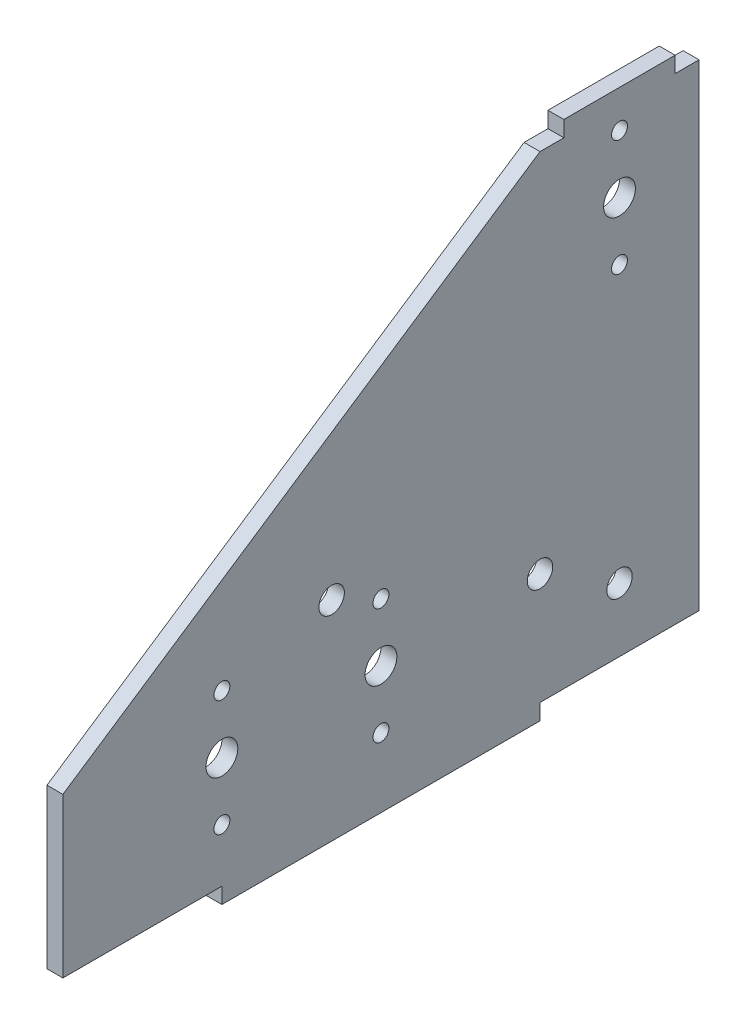
ISO-10303-21;
HEADER;
FILE_DESCRIPTION(('STEP AP214'),'2;1');
FILE_NAME('part.step','',(''),(''),'','','');
FILE_SCHEMA(('AUTOMOTIVE_DESIGN { 1 0 10303 214 1 1 1 1 }'));
ENDSEC;
DATA;
#1=APPLICATION_CONTEXT('core data for automotive mechanical design processes');
#2=APPLICATION_PROTOCOL_DEFINITION('international standard','automotive_design',2000,#1);
#3=PRODUCT_CONTEXT('',#1,'mechanical');
#4=PRODUCT('Part','Part','',(#3));
#5=PRODUCT_RELATED_PRODUCT_CATEGORY('part','',(#4));
#6=PRODUCT_DEFINITION_FORMATION('','',#4);
#7=PRODUCT_DEFINITION_CONTEXT('part definition',#1,'design');
#8=PRODUCT_DEFINITION('design','',#6,#7);
#9=PRODUCT_DEFINITION_SHAPE('','',#8);
#10=(LENGTH_UNIT() NAMED_UNIT(*) SI_UNIT(.MILLI.,.METRE.));
#11=(NAMED_UNIT(*) PLANE_ANGLE_UNIT() SI_UNIT($,.RADIAN.));
#12=(NAMED_UNIT(*) SI_UNIT($,.STERADIAN.) SOLID_ANGLE_UNIT());
#13=UNCERTAINTY_MEASURE_WITH_UNIT(LENGTH_MEASURE(1.E-05),#10,'distance_accuracy_value','');
#14=(GEOMETRIC_REPRESENTATION_CONTEXT(3) GLOBAL_UNCERTAINTY_ASSIGNED_CONTEXT((#13)) GLOBAL_UNIT_ASSIGNED_CONTEXT((#10,
#11,#12)) REPRESENTATION_CONTEXT('',''));
#15=CARTESIAN_POINT('',(0.,0.,0.));
#16=DIRECTION('',(0.,0.,1.));
#17=DIRECTION('',(1.,0.,0.));
#18=AXIS2_PLACEMENT_3D('',#15,#16,#17);
#19=CARTESIAN_POINT('',(5.,0.,0.));
#20=DIRECTION('',(1.,0.,0.));
#21=DIRECTION('',(0.,0.,-1.));
#22=AXIS2_PLACEMENT_3D('',#19,#20,#21);
#23=PLANE('',#22);
#24=CARTESIAN_POINT('',(5.,53.2499999999997,-50.));
#25=DIRECTION('',(1.,0.,0.));
#26=DIRECTION('',(0.,0.,-1.));
#27=AXIS2_PLACEMENT_3D('',#24,#25,#26);
#28=CIRCLE('',#27,2.5);
#29=CARTESIAN_POINT('',(5.,53.2499999999997,-52.5));
#30=VERTEX_POINT('',#29);
#31=EDGE_CURVE('E337',#30,#30,#28,.T.);
#32=ORIENTED_EDGE('',*,*,#31,.F.);
#33=EDGE_LOOP('',(#32));
#34=FACE_BOUND('',#33,.T.);
#35=CARTESIAN_POINT('',(5.,16.75,-100.));
#36=DIRECTION('',(1.,0.,0.));
#37=DIRECTION('',(0.,0.,-1.));
#38=AXIS2_PLACEMENT_3D('',#35,#36,#37);
#39=CIRCLE('',#38,2.50000000000001);
#40=CARTESIAN_POINT('',(5.,16.75,-102.5));
#41=VERTEX_POINT('',#40);
#42=EDGE_CURVE('E349',#41,#41,#39,.T.);
#43=ORIENTED_EDGE('',*,*,#42,.F.);
#44=EDGE_LOOP('',(#43));
#45=FACE_BOUND('',#44,.T.);
#46=CARTESIAN_POINT('',(5.,60.6855990780826,-84.5));
#47=DIRECTION('',(1.,0.,0.));
#48=DIRECTION('',(0.,0.,-1.));
#49=AXIS2_PLACEMENT_3D('',#46,#47,#48);
#50=CIRCLE('',#49,4.00000000000001);
#51=CARTESIAN_POINT('',(5.,60.6855990780826,-88.5));
#52=VERTEX_POINT('',#51);
#53=EDGE_CURVE('E361',#52,#52,#50,.T.);
#54=ORIENTED_EDGE('',*,*,#53,.F.);
#55=EDGE_LOOP('',(#54));
#56=FACE_BOUND('',#55,.T.);
#57=CARTESIAN_POINT('',(5.,106.75,-175.));
#58=DIRECTION('',(1.,0.,0.));
#59=DIRECTION('',(0.,0.,-1.));
#60=AXIS2_PLACEMENT_3D('',#57,#58,#59);
#61=CIRCLE('',#60,2.50000000000002);
#62=CARTESIAN_POINT('',(5.,106.75,-177.5));
#63=VERTEX_POINT('',#62);
#64=EDGE_CURVE('E373',#63,#63,#61,.T.);
#65=ORIENTED_EDGE('',*,*,#64,.F.);
#66=EDGE_LOOP('',(#65));
#67=FACE_BOUND('',#66,.T.);
#68=CARTESIAN_POINT('',(5.,35.,-150.));
#69=DIRECTION('',(1.,0.,0.));
#70=DIRECTION('',(0.,0.,-1.));
#71=AXIS2_PLACEMENT_3D('',#68,#69,#70);
#72=CIRCLE('',#71,3.99999999999999);
#73=CARTESIAN_POINT('',(5.,35.,-154.));
#74=VERTEX_POINT('',#73);
#75=EDGE_CURVE('E385',#74,#74,#72,.T.);
#76=ORIENTED_EDGE('',*,*,#75,.F.);
#77=EDGE_LOOP('',(#76));
#78=FACE_BOUND('',#77,.T.);
#79=CARTESIAN_POINT('',(5.,125.,-175.));
#80=DIRECTION('',(1.,0.,0.));
#81=DIRECTION('',(0.,0.,-1.));
#82=AXIS2_PLACEMENT_3D('',#79,#80,#81);
#83=CIRCLE('',#82,4.99999999999999);
#84=CARTESIAN_POINT('',(5.,125.,-180.));
#85=VERTEX_POINT('',#84);
#86=EDGE_CURVE('E164',#85,#85,#83,.T.);
#87=ORIENTED_EDGE('',*,*,#86,.F.);
#88=EDGE_LOOP('',(#87));
#89=FACE_BOUND('',#88,.T.);
#90=DIRECTION('',(0.,0.,1.));
#91=VECTOR('',#90,1.);
#92=CARTESIAN_POINT('',(5.,150.,-192.5));
#93=LINE('',#92,#91);
#94=CARTESIAN_POINT('',(5.,150.,-200.));
#95=VERTEX_POINT('',#94);
#96=CARTESIAN_POINT('',(5.,150.,-192.5));
#97=VERTEX_POINT('',#96);
#98=EDGE_CURVE('E185',#95,#97,#93,.T.);
#99=ORIENTED_EDGE('',*,*,#98,.T.);
#100=DIRECTION('',(0.,1.,0.));
#101=VECTOR('',#100,1.);
#102=CARTESIAN_POINT('',(5.,150.,-192.5));
#103=LINE('',#102,#101);
#104=CARTESIAN_POINT('',(5.,155.,-192.5));
#105=VERTEX_POINT('',#104);
#106=EDGE_CURVE('E108',#97,#105,#103,.T.);
#107=ORIENTED_EDGE('',*,*,#106,.T.);
#108=DIRECTION('',(0.,0.,1.));
#109=VECTOR('',#108,1.);
#110=CARTESIAN_POINT('',(5.,155.,-157.5));
#111=LINE('',#110,#109);
#112=CARTESIAN_POINT('',(5.,155.,-157.5));
#113=VERTEX_POINT('',#112);
#114=EDGE_CURVE('E215',#105,#113,#111,.T.);
#115=ORIENTED_EDGE('',*,*,#114,.T.);
#116=DIRECTION('',(0.,-1.,0.));
#117=VECTOR('',#116,1.);
#118=CARTESIAN_POINT('',(5.,150.,-157.5));
#119=LINE('',#118,#117);
#120=CARTESIAN_POINT('',(5.,150.,-157.5));
#121=VERTEX_POINT('',#120);
#122=EDGE_CURVE('E234',#113,#121,#119,.T.);
#123=ORIENTED_EDGE('',*,*,#122,.T.);
#124=DIRECTION('',(0.,0.,1.));
#125=VECTOR('',#124,1.);
#126=CARTESIAN_POINT('',(5.,150.,-150.));
#127=LINE('',#126,#125);
#128=CARTESIAN_POINT('',(5.,150.,-150.));
#129=VERTEX_POINT('',#128);
#130=EDGE_CURVE('E231',#121,#129,#127,.T.);
#131=ORIENTED_EDGE('',*,*,#130,.T.);
#132=DIRECTION('',(0.,-0.554700196225229,0.832050294337844));
#133=VECTOR('',#132,1.);
#134=CARTESIAN_POINT('',(5.,150.,-150.));
#135=LINE('',#134,#133);
#136=CARTESIAN_POINT('',(5.,50.,0.));
#137=VERTEX_POINT('',#136);
#138=EDGE_CURVE('E233',#129,#137,#135,.T.);
#139=ORIENTED_EDGE('',*,*,#138,.T.);
#140=DIRECTION('',(0.,-1.,0.));
#141=VECTOR('',#140,1.);
#142=CARTESIAN_POINT('',(5.,0.,0.));
#143=LINE('',#142,#141);
#144=CARTESIAN_POINT('',(5.,0.,0.));
#145=VERTEX_POINT('',#144);
#146=EDGE_CURVE('E236',#137,#145,#143,.T.);
#147=ORIENTED_EDGE('',*,*,#146,.T.);
#148=DIRECTION('',(0.,0.,-1.));
#149=VECTOR('',#148,1.);
#150=CARTESIAN_POINT('',(5.,0.,0.));
#151=LINE('',#150,#149);
#152=CARTESIAN_POINT('',(5.,0.,-50.));
#153=VERTEX_POINT('',#152);
#154=EDGE_CURVE('E242',#145,#153,#151,.T.);
#155=ORIENTED_EDGE('',*,*,#154,.T.);
#156=DIRECTION('',(0.,-1.,0.));
#157=VECTOR('',#156,1.);
#158=CARTESIAN_POINT('',(5.,0.,-50.));
#159=LINE('',#158,#157);
#160=CARTESIAN_POINT('',(5.,-5.,-50.));
#161=VERTEX_POINT('',#160);
#162=EDGE_CURVE('E244',#153,#161,#159,.T.);
#163=ORIENTED_EDGE('',*,*,#162,.T.);
#164=DIRECTION('',(0.,0.,-1.));
#165=VECTOR('',#164,1.);
#166=CARTESIAN_POINT('',(5.,-5.,-50.));
#167=LINE('',#166,#165);
#168=CARTESIAN_POINT('',(5.,-5.,-150.));
#169=VERTEX_POINT('',#168);
#170=EDGE_CURVE('E142',#161,#169,#167,.T.);
#171=ORIENTED_EDGE('',*,*,#170,.T.);
#172=DIRECTION('',(0.,1.,0.));
#173=VECTOR('',#172,1.);
#174=CARTESIAN_POINT('',(5.,0.,-150.));
#175=LINE('',#174,#173);
#176=CARTESIAN_POINT('',(5.,0.,-150.));
#177=VERTEX_POINT('',#176);
#178=EDGE_CURVE('E136',#169,#177,#175,.T.);
#179=ORIENTED_EDGE('',*,*,#178,.T.);
#180=DIRECTION('',(0.,0.,-1.));
#181=VECTOR('',#180,1.);
#182=CARTESIAN_POINT('',(5.,0.,-150.));
#183=LINE('',#182,#181);
#184=CARTESIAN_POINT('',(5.,0.,-200.));
#185=VERTEX_POINT('',#184);
#186=EDGE_CURVE('E140',#177,#185,#183,.T.);
#187=ORIENTED_EDGE('',*,*,#186,.T.);
#188=DIRECTION('',(0.,1.,0.));
#189=VECTOR('',#188,1.);
#190=CARTESIAN_POINT('',(5.,0.,-200.));
#191=LINE('',#190,#189);
#192=EDGE_CURVE('E50',#185,#95,#191,.T.);
#193=ORIENTED_EDGE('',*,*,#192,.T.);
#194=EDGE_LOOP('',(#99,#107,#115,#123,#131,#139,#147,#155,#163,#171,#179,#187,#193));
#195=FACE_BOUND('',#194,.T.);
#196=CARTESIAN_POINT('',(5.,20.,-175.));
#197=DIRECTION('',(1.,0.,0.));
#198=DIRECTION('',(0.,0.,-1.));
#199=AXIS2_PLACEMENT_3D('',#196,#197,#198);
#200=CIRCLE('',#199,3.99999999999999);
#201=CARTESIAN_POINT('',(5.,20.,-179.));
#202=VERTEX_POINT('',#201);
#203=EDGE_CURVE('E391',#202,#202,#200,.T.);
#204=ORIENTED_EDGE('',*,*,#203,.F.);
#205=EDGE_LOOP('',(#204));
#206=FACE_BOUND('',#205,.T.);
#207=CARTESIAN_POINT('',(5.,143.25,-175.));
#208=DIRECTION('',(1.,0.,0.));
#209=DIRECTION('',(0.,0.,-1.));
#210=AXIS2_PLACEMENT_3D('',#207,#208,#209);
#211=CIRCLE('',#210,2.50000000000002);
#212=CARTESIAN_POINT('',(5.,143.25,-177.5));
#213=VERTEX_POINT('',#212);
#214=EDGE_CURVE('E379',#213,#213,#211,.T.);
#215=ORIENTED_EDGE('',*,*,#214,.F.);
#216=EDGE_LOOP('',(#215));
#217=FACE_BOUND('',#216,.T.);
#218=CARTESIAN_POINT('',(5.,35.,-100.));
#219=DIRECTION('',(1.,0.,0.));
#220=DIRECTION('',(0.,0.,-1.));
#221=AXIS2_PLACEMENT_3D('',#218,#219,#220);
#222=CIRCLE('',#221,5.00000000000001);
#223=CARTESIAN_POINT('',(5.,35.,-105.));
#224=VERTEX_POINT('',#223);
#225=EDGE_CURVE('E367',#224,#224,#222,.T.);
#226=ORIENTED_EDGE('',*,*,#225,.F.);
#227=EDGE_LOOP('',(#226));
#228=FACE_BOUND('',#227,.T.);
#229=CARTESIAN_POINT('',(5.,53.25,-100.));
#230=DIRECTION('',(1.,0.,0.));
#231=DIRECTION('',(0.,0.,-1.));
#232=AXIS2_PLACEMENT_3D('',#229,#230,#231);
#233=CIRCLE('',#232,2.49999999999999);
#234=CARTESIAN_POINT('',(5.,53.25,-102.5));
#235=VERTEX_POINT('',#234);
#236=EDGE_CURVE('E355',#235,#235,#233,.T.);
#237=ORIENTED_EDGE('',*,*,#236,.F.);
#238=EDGE_LOOP('',(#237));
#239=FACE_BOUND('',#238,.T.);
#240=CARTESIAN_POINT('',(5.,34.9999999999997,-50.));
#241=DIRECTION('',(1.,0.,0.));
#242=DIRECTION('',(0.,0.,-1.));
#243=AXIS2_PLACEMENT_3D('',#240,#241,#242);
#244=CIRCLE('',#243,5.);
#245=CARTESIAN_POINT('',(5.,34.9999999999997,-55.));
#246=VERTEX_POINT('',#245);
#247=EDGE_CURVE('E343',#246,#246,#244,.T.);
#248=ORIENTED_EDGE('',*,*,#247,.F.);
#249=EDGE_LOOP('',(#248));
#250=FACE_BOUND('',#249,.T.);
#251=CARTESIAN_POINT('',(5.,16.7499999999997,-50.0000000000004));
#252=DIRECTION('',(1.,0.,0.));
#253=DIRECTION('',(0.,0.,-1.));
#254=AXIS2_PLACEMENT_3D('',#251,#252,#253);
#255=CIRCLE('',#254,2.50000000000001);
#256=CARTESIAN_POINT('',(5.,16.7499999999997,-52.5000000000004));
#257=VERTEX_POINT('',#256);
#258=EDGE_CURVE('E328',#257,#257,#255,.T.);
#259=ORIENTED_EDGE('',*,*,#258,.F.);
#260=EDGE_LOOP('',(#259));
#261=FACE_BOUND('',#260,.T.);
#262=ADVANCED_FACE('F33',(#34,#45,#56,#67,#78,#89,#195,#206,#217,#228,#239,#250,#261),#23,.T.);
#263=CARTESIAN_POINT('',(0.,0.,0.));
#264=DIRECTION('',(1.,0.,0.));
#265=DIRECTION('',(0.,0.,-1.));
#266=AXIS2_PLACEMENT_3D('',#263,#264,#265);
#267=PLANE('',#266);
#268=CARTESIAN_POINT('',(0.,53.2499999999997,-50.));
#269=DIRECTION('',(1.,0.,0.));
#270=DIRECTION('',(0.,0.,-1.));
#271=AXIS2_PLACEMENT_3D('',#268,#269,#270);
#272=CIRCLE('',#271,2.5);
#273=CARTESIAN_POINT('',(0.,53.2499999999997,-52.5));
#274=VERTEX_POINT('',#273);
#275=EDGE_CURVE('E334',#274,#274,#272,.T.);
#276=ORIENTED_EDGE('',*,*,#275,.T.);
#277=EDGE_LOOP('',(#276));
#278=FACE_BOUND('',#277,.T.);
#279=CARTESIAN_POINT('',(0.,16.75,-100.));
#280=DIRECTION('',(1.,0.,0.));
#281=DIRECTION('',(0.,0.,-1.));
#282=AXIS2_PLACEMENT_3D('',#279,#280,#281);
#283=CIRCLE('',#282,2.50000000000001);
#284=CARTESIAN_POINT('',(0.,16.75,-102.5));
#285=VERTEX_POINT('',#284);
#286=EDGE_CURVE('E346',#285,#285,#283,.T.);
#287=ORIENTED_EDGE('',*,*,#286,.T.);
#288=EDGE_LOOP('',(#287));
#289=FACE_BOUND('',#288,.T.);
#290=CARTESIAN_POINT('',(0.,60.6855990780826,-84.5));
#291=DIRECTION('',(1.,0.,0.));
#292=DIRECTION('',(0.,0.,-1.));
#293=AXIS2_PLACEMENT_3D('',#290,#291,#292);
#294=CIRCLE('',#293,4.00000000000001);
#295=CARTESIAN_POINT('',(0.,60.6855990780826,-88.5));
#296=VERTEX_POINT('',#295);
#297=EDGE_CURVE('E358',#296,#296,#294,.T.);
#298=ORIENTED_EDGE('',*,*,#297,.T.);
#299=EDGE_LOOP('',(#298));
#300=FACE_BOUND('',#299,.T.);
#301=CARTESIAN_POINT('',(0.,106.75,-175.));
#302=DIRECTION('',(1.,0.,0.));
#303=DIRECTION('',(0.,0.,-1.));
#304=AXIS2_PLACEMENT_3D('',#301,#302,#303);
#305=CIRCLE('',#304,2.50000000000002);
#306=CARTESIAN_POINT('',(0.,106.75,-177.5));
#307=VERTEX_POINT('',#306);
#308=EDGE_CURVE('E370',#307,#307,#305,.T.);
#309=ORIENTED_EDGE('',*,*,#308,.T.);
#310=EDGE_LOOP('',(#309));
#311=FACE_BOUND('',#310,.T.);
#312=CARTESIAN_POINT('',(0.,35.,-150.));
#313=DIRECTION('',(1.,0.,0.));
#314=DIRECTION('',(0.,0.,-1.));
#315=AXIS2_PLACEMENT_3D('',#312,#313,#314);
#316=CIRCLE('',#315,3.99999999999999);
#317=CARTESIAN_POINT('',(0.,35.,-154.));
#318=VERTEX_POINT('',#317);
#319=EDGE_CURVE('E382',#318,#318,#316,.T.);
#320=ORIENTED_EDGE('',*,*,#319,.T.);
#321=EDGE_LOOP('',(#320));
#322=FACE_BOUND('',#321,.T.);
#323=CARTESIAN_POINT('',(0.,125.,-175.));
#324=DIRECTION('',(1.,0.,0.));
#325=DIRECTION('',(0.,0.,-1.));
#326=AXIS2_PLACEMENT_3D('',#323,#324,#325);
#327=CIRCLE('',#326,4.99999999999999);
#328=CARTESIAN_POINT('',(0.,125.,-180.));
#329=VERTEX_POINT('',#328);
#330=EDGE_CURVE('E394',#329,#329,#327,.T.);
#331=ORIENTED_EDGE('',*,*,#330,.T.);
#332=EDGE_LOOP('',(#331));
#333=FACE_BOUND('',#332,.T.);
#334=DIRECTION('',(0.,0.,1.));
#335=VECTOR('',#334,1.);
#336=CARTESIAN_POINT('',(0.,150.,-192.5));
#337=LINE('',#336,#335);
#338=CARTESIAN_POINT('',(0.,150.,-200.));
#339=VERTEX_POINT('',#338);
#340=CARTESIAN_POINT('',(0.,150.,-192.5));
#341=VERTEX_POINT('',#340);
#342=EDGE_CURVE('E160',#339,#341,#337,.T.);
#343=ORIENTED_EDGE('',*,*,#342,.F.);
#344=DIRECTION('',(0.,1.,0.));
#345=VECTOR('',#344,1.);
#346=CARTESIAN_POINT('',(0.,0.,-200.));
#347=LINE('',#346,#345);
#348=CARTESIAN_POINT('',(0.,0.,-200.));
#349=VERTEX_POINT('',#348);
#350=EDGE_CURVE('E100',#349,#339,#347,.T.);
#351=ORIENTED_EDGE('',*,*,#350,.F.);
#352=DIRECTION('',(0.,0.,-1.));
#353=VECTOR('',#352,1.);
#354=CARTESIAN_POINT('',(0.,0.,-150.));
#355=LINE('',#354,#353);
#356=CARTESIAN_POINT('',(0.,0.,-150.));
#357=VERTEX_POINT('',#356);
#358=EDGE_CURVE('E94',#357,#349,#355,.T.);
#359=ORIENTED_EDGE('',*,*,#358,.F.);
#360=DIRECTION('',(0.,1.,0.));
#361=VECTOR('',#360,1.);
#362=CARTESIAN_POINT('',(0.,0.,-150.));
#363=LINE('',#362,#361);
#364=CARTESIAN_POINT('',(0.,-5.,-150.));
#365=VERTEX_POINT('',#364);
#366=EDGE_CURVE('E150',#365,#357,#363,.T.);
#367=ORIENTED_EDGE('',*,*,#366,.F.);
#368=DIRECTION('',(0.,0.,-1.));
#369=VECTOR('',#368,1.);
#370=CARTESIAN_POINT('',(0.,-5.,-50.));
#371=LINE('',#370,#369);
#372=CARTESIAN_POINT('',(0.,-5.,-50.));
#373=VERTEX_POINT('',#372);
#374=EDGE_CURVE('E180',#373,#365,#371,.T.);
#375=ORIENTED_EDGE('',*,*,#374,.F.);
#376=DIRECTION('',(0.,-1.,0.));
#377=VECTOR('',#376,1.);
#378=CARTESIAN_POINT('',(0.,0.,-50.));
#379=LINE('',#378,#377);
#380=CARTESIAN_POINT('',(0.,0.,-50.));
#381=VERTEX_POINT('',#380);
#382=EDGE_CURVE('E178',#381,#373,#379,.T.);
#383=ORIENTED_EDGE('',*,*,#382,.F.);
#384=DIRECTION('',(0.,0.,-1.));
#385=VECTOR('',#384,1.);
#386=CARTESIAN_POINT('',(0.,0.,0.));
#387=LINE('',#386,#385);
#388=CARTESIAN_POINT('',(0.,0.,0.));
#389=VERTEX_POINT('',#388);
#390=EDGE_CURVE('E176',#389,#381,#387,.T.);
#391=ORIENTED_EDGE('',*,*,#390,.F.);
#392=DIRECTION('',(0.,-1.,0.));
#393=VECTOR('',#392,1.);
#394=CARTESIAN_POINT('',(0.,0.,0.));
#395=LINE('',#394,#393);
#396=CARTESIAN_POINT('',(0.,50.,0.));
#397=VERTEX_POINT('',#396);
#398=EDGE_CURVE('E174',#397,#389,#395,.T.);
#399=ORIENTED_EDGE('',*,*,#398,.F.);
#400=DIRECTION('',(0.,-0.554700196225229,0.832050294337844));
#401=VECTOR('',#400,1.);
#402=CARTESIAN_POINT('',(0.,150.,-150.));
#403=LINE('',#402,#401);
#404=CARTESIAN_POINT('',(0.,150.,-150.));
#405=VERTEX_POINT('',#404);
#406=EDGE_CURVE('E172',#405,#397,#403,.T.);
#407=ORIENTED_EDGE('',*,*,#406,.F.);
#408=DIRECTION('',(0.,0.,1.));
#409=VECTOR('',#408,1.);
#410=CARTESIAN_POINT('',(0.,150.,-150.));
#411=LINE('',#410,#409);
#412=CARTESIAN_POINT('',(0.,150.,-157.5));
#413=VERTEX_POINT('',#412);
#414=EDGE_CURVE('E170',#413,#405,#411,.T.);
#415=ORIENTED_EDGE('',*,*,#414,.F.);
#416=DIRECTION('',(0.,-1.,0.));
#417=VECTOR('',#416,1.);
#418=CARTESIAN_POINT('',(0.,150.,-157.5));
#419=LINE('',#418,#417);
#420=CARTESIAN_POINT('',(0.,155.,-157.5));
#421=VERTEX_POINT('',#420);
#422=EDGE_CURVE('E168',#421,#413,#419,.T.);
#423=ORIENTED_EDGE('',*,*,#422,.F.);
#424=DIRECTION('',(0.,0.,1.));
#425=VECTOR('',#424,1.);
#426=CARTESIAN_POINT('',(0.,155.,-157.5));
#427=LINE('',#426,#425);
#428=CARTESIAN_POINT('',(0.,155.,-192.5));
#429=VERTEX_POINT('',#428);
#430=EDGE_CURVE('E166',#429,#421,#427,.T.);
#431=ORIENTED_EDGE('',*,*,#430,.F.);
#432=DIRECTION('',(0.,1.,0.));
#433=VECTOR('',#432,1.);
#434=CARTESIAN_POINT('',(0.,150.,-192.5));
#435=LINE('',#434,#433);
#436=EDGE_CURVE('E163',#341,#429,#435,.T.);
#437=ORIENTED_EDGE('',*,*,#436,.F.);
#438=EDGE_LOOP('',(#343,#351,#359,#367,#375,#383,#391,#399,#407,#415,#423,#431,#437));
#439=FACE_BOUND('',#438,.T.);
#440=CARTESIAN_POINT('',(0.,20.,-175.));
#441=DIRECTION('',(1.,0.,0.));
#442=DIRECTION('',(0.,0.,-1.));
#443=AXIS2_PLACEMENT_3D('',#440,#441,#442);
#444=CIRCLE('',#443,3.99999999999999);
#445=CARTESIAN_POINT('',(0.,20.,-179.));
#446=VERTEX_POINT('',#445);
#447=EDGE_CURVE('E388',#446,#446,#444,.T.);
#448=ORIENTED_EDGE('',*,*,#447,.T.);
#449=EDGE_LOOP('',(#448));
#450=FACE_BOUND('',#449,.T.);
#451=CARTESIAN_POINT('',(0.,143.25,-175.));
#452=DIRECTION('',(1.,0.,0.));
#453=DIRECTION('',(0.,0.,-1.));
#454=AXIS2_PLACEMENT_3D('',#451,#452,#453);
#455=CIRCLE('',#454,2.50000000000002);
#456=CARTESIAN_POINT('',(0.,143.25,-177.5));
#457=VERTEX_POINT('',#456);
#458=EDGE_CURVE('E376',#457,#457,#455,.T.);
#459=ORIENTED_EDGE('',*,*,#458,.T.);
#460=EDGE_LOOP('',(#459));
#461=FACE_BOUND('',#460,.T.);
#462=CARTESIAN_POINT('',(0.,35.,-100.));
#463=DIRECTION('',(1.,0.,0.));
#464=DIRECTION('',(0.,0.,-1.));
#465=AXIS2_PLACEMENT_3D('',#462,#463,#464);
#466=CIRCLE('',#465,5.00000000000001);
#467=CARTESIAN_POINT('',(0.,35.,-105.));
#468=VERTEX_POINT('',#467);
#469=EDGE_CURVE('E364',#468,#468,#466,.T.);
#470=ORIENTED_EDGE('',*,*,#469,.T.);
#471=EDGE_LOOP('',(#470));
#472=FACE_BOUND('',#471,.T.);
#473=CARTESIAN_POINT('',(0.,53.25,-100.));
#474=DIRECTION('',(1.,0.,0.));
#475=DIRECTION('',(0.,0.,-1.));
#476=AXIS2_PLACEMENT_3D('',#473,#474,#475);
#477=CIRCLE('',#476,2.49999999999999);
#478=CARTESIAN_POINT('',(0.,53.25,-102.5));
#479=VERTEX_POINT('',#478);
#480=EDGE_CURVE('E352',#479,#479,#477,.T.);
#481=ORIENTED_EDGE('',*,*,#480,.T.);
#482=EDGE_LOOP('',(#481));
#483=FACE_BOUND('',#482,.T.);
#484=CARTESIAN_POINT('',(0.,34.9999999999997,-50.));
#485=DIRECTION('',(1.,0.,0.));
#486=DIRECTION('',(0.,0.,-1.));
#487=AXIS2_PLACEMENT_3D('',#484,#485,#486);
#488=CIRCLE('',#487,5.);
#489=CARTESIAN_POINT('',(0.,34.9999999999997,-55.));
#490=VERTEX_POINT('',#489);
#491=EDGE_CURVE('E340',#490,#490,#488,.T.);
#492=ORIENTED_EDGE('',*,*,#491,.T.);
#493=EDGE_LOOP('',(#492));
#494=FACE_BOUND('',#493,.T.);
#495=CARTESIAN_POINT('',(0.,16.7499999999997,-50.0000000000004));
#496=DIRECTION('',(1.,0.,0.));
#497=DIRECTION('',(0.,0.,-1.));
#498=AXIS2_PLACEMENT_3D('',#495,#496,#497);
#499=CIRCLE('',#498,2.50000000000001);
#500=CARTESIAN_POINT('',(0.,16.7499999999997,-52.5000000000004));
#501=VERTEX_POINT('',#500);
#502=EDGE_CURVE('E331',#501,#501,#499,.T.);
#503=ORIENTED_EDGE('',*,*,#502,.T.);
#504=EDGE_LOOP('',(#503));
#505=FACE_BOUND('',#504,.T.);
#506=ADVANCED_FACE('F219',(#278,#289,#300,#311,#322,#333,#439,#450,#461,#472,#483,#494,#505),
#267,.F.);
#507=CARTESIAN_POINT('',(5.,150.,-192.5));
#508=DIRECTION('',(0.,-1.,0.));
#509=DIRECTION('',(0.,0.,-1.));
#510=AXIS2_PLACEMENT_3D('',#507,#508,#509);
#511=PLANE('',#510);
#512=ORIENTED_EDGE('',*,*,#342,.T.);
#513=DIRECTION('',(-1.,0.,0.));
#514=VECTOR('',#513,1.);
#515=CARTESIAN_POINT('',(5.,150.,-192.5));
#516=LINE('',#515,#514);
#517=EDGE_CURVE('E11',#97,#341,#516,.T.);
#518=ORIENTED_EDGE('',*,*,#517,.F.);
#519=ORIENTED_EDGE('',*,*,#98,.F.);
#520=DIRECTION('',(-1.,0.,0.));
#521=VECTOR('',#520,1.);
#522=CARTESIAN_POINT('',(5.,150.,-200.));
#523=LINE('',#522,#521);
#524=EDGE_CURVE('E156',#95,#339,#523,.T.);
#525=ORIENTED_EDGE('',*,*,#524,.T.);
#526=EDGE_LOOP('',(#512,#518,#519,#525));
#527=FACE_BOUND('',#526,.T.);
#528=ADVANCED_FACE('F35',(#527),#511,.F.);
#529=CARTESIAN_POINT('',(5.,150.,-192.5));
#530=DIRECTION('',(0.,0.,1.));
#531=DIRECTION('',(1.,0.,0.));
#532=AXIS2_PLACEMENT_3D('',#529,#530,#531);
#533=PLANE('',#532);
#534=ORIENTED_EDGE('',*,*,#436,.T.);
#535=DIRECTION('',(-1.,0.,0.));
#536=VECTOR('',#535,1.);
#537=CARTESIAN_POINT('',(5.,155.,-192.5));
#538=LINE('',#537,#536);
#539=EDGE_CURVE('E42',#105,#429,#538,.T.);
#540=ORIENTED_EDGE('',*,*,#539,.F.);
#541=ORIENTED_EDGE('',*,*,#106,.F.);
#542=ORIENTED_EDGE('',*,*,#517,.T.);
#543=EDGE_LOOP('',(#534,#540,#541,#542));
#544=FACE_BOUND('',#543,.T.);
#545=ADVANCED_FACE('F585',(#544),#533,.F.);
#546=CARTESIAN_POINT('',(5.,155.,-157.5));
#547=DIRECTION('',(0.,-1.,0.));
#548=DIRECTION('',(0.,0.,-1.));
#549=AXIS2_PLACEMENT_3D('',#546,#547,#548);
#550=PLANE('',#549);
#551=ORIENTED_EDGE('',*,*,#430,.T.);
#552=DIRECTION('',(-1.,0.,0.));
#553=VECTOR('',#552,1.);
#554=CARTESIAN_POINT('',(5.,155.,-157.5));
#555=LINE('',#554,#553);
#556=EDGE_CURVE('E207',#113,#421,#555,.T.);
#557=ORIENTED_EDGE('',*,*,#556,.F.);
#558=ORIENTED_EDGE('',*,*,#114,.F.);
#559=ORIENTED_EDGE('',*,*,#539,.T.);
#560=EDGE_LOOP('',(#551,#557,#558,#559));
#561=FACE_BOUND('',#560,.T.);
#562=ADVANCED_FACE('F213',(#561),#550,.F.);
#563=CARTESIAN_POINT('',(5.,150.,-157.5));
#564=DIRECTION('',(0.,0.,-1.));
#565=DIRECTION('',(-1.,0.,0.));
#566=AXIS2_PLACEMENT_3D('',#563,#564,#565);
#567=PLANE('',#566);
#568=ORIENTED_EDGE('',*,*,#422,.T.);
#569=DIRECTION('',(-1.,0.,0.));
#570=VECTOR('',#569,1.);
#571=CARTESIAN_POINT('',(5.,150.,-157.5));
#572=LINE('',#571,#570);
#573=EDGE_CURVE('E204',#121,#413,#572,.T.);
#574=ORIENTED_EDGE('',*,*,#573,.F.);
#575=ORIENTED_EDGE('',*,*,#122,.F.);
#576=ORIENTED_EDGE('',*,*,#556,.T.);
#577=EDGE_LOOP('',(#568,#574,#575,#576));
#578=FACE_BOUND('',#577,.T.);
#579=ADVANCED_FACE('F225',(#578),#567,.F.);
#580=CARTESIAN_POINT('',(5.,150.,-150.));
#581=DIRECTION('',(0.,-1.,0.));
#582=DIRECTION('',(0.,0.,-1.));
#583=AXIS2_PLACEMENT_3D('',#580,#581,#582);
#584=PLANE('',#583);
#585=ORIENTED_EDGE('',*,*,#414,.T.);
#586=DIRECTION('',(-1.,0.,0.));
#587=VECTOR('',#586,1.);
#588=CARTESIAN_POINT('',(5.,150.,-150.));
#589=LINE('',#588,#587);
#590=EDGE_CURVE('E201',#129,#405,#589,.T.);
#591=ORIENTED_EDGE('',*,*,#590,.F.);
#592=ORIENTED_EDGE('',*,*,#130,.F.);
#593=ORIENTED_EDGE('',*,*,#573,.T.);
#594=EDGE_LOOP('',(#585,#591,#592,#593));
#595=FACE_BOUND('',#594,.T.);
#596=ADVANCED_FACE('F229',(#595),#584,.F.);
#597=CARTESIAN_POINT('',(5.,150.,-150.));
#598=DIRECTION('',(0.,-0.832050294337844,-0.554700196225229));
#599=DIRECTION('',(0.,0.554700196225229,-0.832050294337844));
#600=AXIS2_PLACEMENT_3D('',#597,#598,#599);
#601=PLANE('',#600);
#602=ORIENTED_EDGE('',*,*,#406,.T.);
#603=DIRECTION('',(-1.,0.,0.));
#604=VECTOR('',#603,1.);
#605=CARTESIAN_POINT('',(5.,50.,0.));
#606=LINE('',#605,#604);
#607=EDGE_CURVE('E198',#137,#397,#606,.T.);
#608=ORIENTED_EDGE('',*,*,#607,.F.);
#609=ORIENTED_EDGE('',*,*,#138,.F.);
#610=ORIENTED_EDGE('',*,*,#590,.T.);
#611=EDGE_LOOP('',(#602,#608,#609,#610));
#612=FACE_BOUND('',#611,.T.);
#613=ADVANCED_FACE('F550',(#612),#601,.F.);
#614=CARTESIAN_POINT('',(5.,0.,0.));
#615=DIRECTION('',(0.,0.,-1.));
#616=DIRECTION('',(-1.,0.,0.));
#617=AXIS2_PLACEMENT_3D('',#614,#615,#616);
#618=PLANE('',#617);
#619=ORIENTED_EDGE('',*,*,#398,.T.);
#620=DIRECTION('',(-1.,0.,0.));
#621=VECTOR('',#620,1.);
#622=CARTESIAN_POINT('',(5.,0.,0.));
#623=LINE('',#622,#621);
#624=EDGE_CURVE('E195',#145,#389,#623,.T.);
#625=ORIENTED_EDGE('',*,*,#624,.F.);
#626=ORIENTED_EDGE('',*,*,#146,.F.);
#627=ORIENTED_EDGE('',*,*,#607,.T.);
#628=EDGE_LOOP('',(#619,#625,#626,#627));
#629=FACE_BOUND('',#628,.T.);
#630=ADVANCED_FACE('F540',(#629),#618,.F.);
#631=CARTESIAN_POINT('',(5.,0.,0.));
#632=DIRECTION('',(0.,1.,0.));
#633=DIRECTION('',(0.,0.,1.));
#634=AXIS2_PLACEMENT_3D('',#631,#632,#633);
#635=PLANE('',#634);
#636=ORIENTED_EDGE('',*,*,#390,.T.);
#637=DIRECTION('',(-1.,0.,0.));
#638=VECTOR('',#637,1.);
#639=CARTESIAN_POINT('',(5.,0.,-50.));
#640=LINE('',#639,#638);
#641=EDGE_CURVE('E192',#153,#381,#640,.T.);
#642=ORIENTED_EDGE('',*,*,#641,.F.);
#643=ORIENTED_EDGE('',*,*,#154,.F.);
#644=ORIENTED_EDGE('',*,*,#624,.T.);
#645=EDGE_LOOP('',(#636,#642,#643,#644));
#646=FACE_BOUND('',#645,.T.);
#647=ADVANCED_FACE('F531',(#646),#635,.F.);
#648=CARTESIAN_POINT('',(5.,0.,-50.));
#649=DIRECTION('',(0.,0.,-1.));
#650=DIRECTION('',(-1.,0.,0.));
#651=AXIS2_PLACEMENT_3D('',#648,#649,#650);
#652=PLANE('',#651);
#653=ORIENTED_EDGE('',*,*,#382,.T.);
#654=DIRECTION('',(-1.,0.,0.));
#655=VECTOR('',#654,1.);
#656=CARTESIAN_POINT('',(5.,-5.,-50.));
#657=LINE('',#656,#655);
#658=EDGE_CURVE('E189',#161,#373,#657,.T.);
#659=ORIENTED_EDGE('',*,*,#658,.F.);
#660=ORIENTED_EDGE('',*,*,#162,.F.);
#661=ORIENTED_EDGE('',*,*,#641,.T.);
#662=EDGE_LOOP('',(#653,#659,#660,#661));
#663=FACE_BOUND('',#662,.T.);
#664=ADVANCED_FACE('F250',(#663),#652,.F.);
#665=CARTESIAN_POINT('',(5.,-5.,-50.));
#666=DIRECTION('',(0.,1.,0.));
#667=DIRECTION('',(0.,0.,1.));
#668=AXIS2_PLACEMENT_3D('',#665,#666,#667);
#669=PLANE('',#668);
#670=ORIENTED_EDGE('',*,*,#374,.T.);
#671=DIRECTION('',(-1.,0.,0.));
#672=VECTOR('',#671,1.);
#673=CARTESIAN_POINT('',(5.,-5.,-150.));
#674=LINE('',#673,#672);
#675=EDGE_CURVE('E151',#169,#365,#674,.T.);
#676=ORIENTED_EDGE('',*,*,#675,.F.);
#677=ORIENTED_EDGE('',*,*,#170,.F.);
#678=ORIENTED_EDGE('',*,*,#658,.T.);
#679=EDGE_LOOP('',(#670,#676,#677,#678));
#680=FACE_BOUND('',#679,.T.);
#681=ADVANCED_FACE('F254',(#680),#669,.F.);
#682=CARTESIAN_POINT('',(5.,0.,-150.));
#683=DIRECTION('',(0.,0.,1.));
#684=DIRECTION('',(1.,0.,0.));
#685=AXIS2_PLACEMENT_3D('',#682,#683,#684);
#686=PLANE('',#685);
#687=ORIENTED_EDGE('',*,*,#366,.T.);
#688=DIRECTION('',(-1.,0.,0.));
#689=VECTOR('',#688,1.);
#690=CARTESIAN_POINT('',(5.,0.,-150.));
#691=LINE('',#690,#689);
#692=EDGE_CURVE('E147',#177,#357,#691,.T.);
#693=ORIENTED_EDGE('',*,*,#692,.F.);
#694=ORIENTED_EDGE('',*,*,#178,.F.);
#695=ORIENTED_EDGE('',*,*,#675,.T.);
#696=EDGE_LOOP('',(#687,#693,#694,#695));
#697=FACE_BOUND('',#696,.T.);
#698=ADVANCED_FACE('F148',(#697),#686,.F.);
#699=CARTESIAN_POINT('',(5.,0.,-150.));
#700=DIRECTION('',(0.,1.,0.));
#701=DIRECTION('',(0.,0.,1.));
#702=AXIS2_PLACEMENT_3D('',#699,#700,#701);
#703=PLANE('',#702);
#704=ORIENTED_EDGE('',*,*,#358,.T.);
#705=DIRECTION('',(-1.,0.,0.));
#706=VECTOR('',#705,1.);
#707=CARTESIAN_POINT('',(5.,0.,-200.));
#708=LINE('',#707,#706);
#709=EDGE_CURVE('E152',#185,#349,#708,.T.);
#710=ORIENTED_EDGE('',*,*,#709,.F.);
#711=ORIENTED_EDGE('',*,*,#186,.F.);
#712=ORIENTED_EDGE('',*,*,#692,.T.);
#713=EDGE_LOOP('',(#704,#710,#711,#712));
#714=FACE_BOUND('',#713,.T.);
#715=ADVANCED_FACE('F154',(#714),#703,.F.);
#716=CARTESIAN_POINT('',(5.,0.,-200.));
#717=DIRECTION('',(0.,0.,1.));
#718=DIRECTION('',(1.,0.,0.));
#719=AXIS2_PLACEMENT_3D('',#716,#717,#718);
#720=PLANE('',#719);
#721=ORIENTED_EDGE('',*,*,#350,.T.);
#722=ORIENTED_EDGE('',*,*,#524,.F.);
#723=ORIENTED_EDGE('',*,*,#192,.F.);
#724=ORIENTED_EDGE('',*,*,#709,.T.);
#725=EDGE_LOOP('',(#721,#722,#723,#724));
#726=FACE_BOUND('',#725,.T.);
#727=ADVANCED_FACE('F258',(#726),#720,.F.);
#728=CARTESIAN_POINT('',(5.,125.,-175.));
#729=DIRECTION('',(-1.,0.,0.));
#730=DIRECTION('',(0.,0.,1.));
#731=AXIS2_PLACEMENT_3D('',#728,#729,#730);
#732=CYLINDRICAL_SURFACE('',#731,4.99999999999999);
#733=ORIENTED_EDGE('',*,*,#86,.T.);
#734=EDGE_LOOP('',(#733));
#735=FACE_BOUND('',#734,.T.);
#736=ORIENTED_EDGE('',*,*,#330,.F.);
#737=EDGE_LOOP('',(#736));
#738=FACE_BOUND('',#737,.T.);
#739=ADVANCED_FACE('F260',(#735,#738),#732,.F.);
#740=CARTESIAN_POINT('',(5.,20.,-175.));
#741=DIRECTION('',(-1.,0.,0.));
#742=DIRECTION('',(0.,0.,1.));
#743=AXIS2_PLACEMENT_3D('',#740,#741,#742);
#744=CYLINDRICAL_SURFACE('',#743,3.99999999999999);
#745=ORIENTED_EDGE('',*,*,#203,.T.);
#746=EDGE_LOOP('',(#745));
#747=FACE_BOUND('',#746,.T.);
#748=ORIENTED_EDGE('',*,*,#447,.F.);
#749=EDGE_LOOP('',(#748));
#750=FACE_BOUND('',#749,.T.);
#751=ADVANCED_FACE('F266',(#747,#750),#744,.F.);
#752=CARTESIAN_POINT('',(5.,35.,-150.));
#753=DIRECTION('',(-1.,0.,0.));
#754=DIRECTION('',(0.,0.,1.));
#755=AXIS2_PLACEMENT_3D('',#752,#753,#754);
#756=CYLINDRICAL_SURFACE('',#755,3.99999999999999);
#757=ORIENTED_EDGE('',*,*,#75,.T.);
#758=EDGE_LOOP('',(#757));
#759=FACE_BOUND('',#758,.T.);
#760=ORIENTED_EDGE('',*,*,#319,.F.);
#761=EDGE_LOOP('',(#760));
#762=FACE_BOUND('',#761,.T.);
#763=ADVANCED_FACE('F283',(#759,#762),#756,.F.);
#764=CARTESIAN_POINT('',(5.,143.25,-175.));
#765=DIRECTION('',(-1.,0.,0.));
#766=DIRECTION('',(0.,0.,1.));
#767=AXIS2_PLACEMENT_3D('',#764,#765,#766);
#768=CYLINDRICAL_SURFACE('',#767,2.50000000000002);
#769=ORIENTED_EDGE('',*,*,#214,.T.);
#770=EDGE_LOOP('',(#769));
#771=FACE_BOUND('',#770,.T.);
#772=ORIENTED_EDGE('',*,*,#458,.F.);
#773=EDGE_LOOP('',(#772));
#774=FACE_BOUND('',#773,.T.);
#775=ADVANCED_FACE('F287',(#771,#774),#768,.F.);
#776=CARTESIAN_POINT('',(5.,106.75,-175.));
#777=DIRECTION('',(-1.,0.,0.));
#778=DIRECTION('',(0.,0.,1.));
#779=AXIS2_PLACEMENT_3D('',#776,#777,#778);
#780=CYLINDRICAL_SURFACE('',#779,2.50000000000002);
#781=ORIENTED_EDGE('',*,*,#64,.T.);
#782=EDGE_LOOP('',(#781));
#783=FACE_BOUND('',#782,.T.);
#784=ORIENTED_EDGE('',*,*,#308,.F.);
#785=EDGE_LOOP('',(#784));
#786=FACE_BOUND('',#785,.T.);
#787=ADVANCED_FACE('F291',(#783,#786),#780,.F.);
#788=CARTESIAN_POINT('',(5.,35.,-100.));
#789=DIRECTION('',(-1.,0.,0.));
#790=DIRECTION('',(0.,0.,1.));
#791=AXIS2_PLACEMENT_3D('',#788,#789,#790);
#792=CYLINDRICAL_SURFACE('',#791,5.00000000000001);
#793=ORIENTED_EDGE('',*,*,#225,.T.);
#794=EDGE_LOOP('',(#793));
#795=FACE_BOUND('',#794,.T.);
#796=ORIENTED_EDGE('',*,*,#469,.F.);
#797=EDGE_LOOP('',(#796));
#798=FACE_BOUND('',#797,.T.);
#799=ADVANCED_FACE('F295',(#795,#798),#792,.F.);
#800=CARTESIAN_POINT('',(5.,60.6855990780826,-84.5));
#801=DIRECTION('',(-1.,0.,0.));
#802=DIRECTION('',(0.,0.,1.));
#803=AXIS2_PLACEMENT_3D('',#800,#801,#802);
#804=CYLINDRICAL_SURFACE('',#803,4.00000000000001);
#805=ORIENTED_EDGE('',*,*,#53,.T.);
#806=EDGE_LOOP('',(#805));
#807=FACE_BOUND('',#806,.T.);
#808=ORIENTED_EDGE('',*,*,#297,.F.);
#809=EDGE_LOOP('',(#808));
#810=FACE_BOUND('',#809,.T.);
#811=ADVANCED_FACE('F299',(#807,#810),#804,.F.);
#812=CARTESIAN_POINT('',(5.,53.25,-100.));
#813=DIRECTION('',(-1.,0.,0.));
#814=DIRECTION('',(0.,0.,1.));
#815=AXIS2_PLACEMENT_3D('',#812,#813,#814);
#816=CYLINDRICAL_SURFACE('',#815,2.49999999999999);
#817=ORIENTED_EDGE('',*,*,#236,.T.);
#818=EDGE_LOOP('',(#817));
#819=FACE_BOUND('',#818,.T.);
#820=ORIENTED_EDGE('',*,*,#480,.F.);
#821=EDGE_LOOP('',(#820));
#822=FACE_BOUND('',#821,.T.);
#823=ADVANCED_FACE('F303',(#819,#822),#816,.F.);
#824=CARTESIAN_POINT('',(5.,16.75,-100.));
#825=DIRECTION('',(-1.,0.,0.));
#826=DIRECTION('',(0.,0.,1.));
#827=AXIS2_PLACEMENT_3D('',#824,#825,#826);
#828=CYLINDRICAL_SURFACE('',#827,2.50000000000001);
#829=ORIENTED_EDGE('',*,*,#42,.T.);
#830=EDGE_LOOP('',(#829));
#831=FACE_BOUND('',#830,.T.);
#832=ORIENTED_EDGE('',*,*,#286,.F.);
#833=EDGE_LOOP('',(#832));
#834=FACE_BOUND('',#833,.T.);
#835=ADVANCED_FACE('F307',(#831,#834),#828,.F.);
#836=CARTESIAN_POINT('',(5.,34.9999999999997,-50.));
#837=DIRECTION('',(-1.,0.,0.));
#838=DIRECTION('',(0.,0.,1.));
#839=AXIS2_PLACEMENT_3D('',#836,#837,#838);
#840=CYLINDRICAL_SURFACE('',#839,5.);
#841=ORIENTED_EDGE('',*,*,#247,.T.);
#842=EDGE_LOOP('',(#841));
#843=FACE_BOUND('',#842,.T.);
#844=ORIENTED_EDGE('',*,*,#491,.F.);
#845=EDGE_LOOP('',(#844));
#846=FACE_BOUND('',#845,.T.);
#847=ADVANCED_FACE('F311',(#843,#846),#840,.F.);
#848=CARTESIAN_POINT('',(5.,53.2499999999997,-50.));
#849=DIRECTION('',(-1.,0.,0.));
#850=DIRECTION('',(0.,0.,1.));
#851=AXIS2_PLACEMENT_3D('',#848,#849,#850);
#852=CYLINDRICAL_SURFACE('',#851,2.5);
#853=ORIENTED_EDGE('',*,*,#31,.T.);
#854=EDGE_LOOP('',(#853));
#855=FACE_BOUND('',#854,.T.);
#856=ORIENTED_EDGE('',*,*,#275,.F.);
#857=EDGE_LOOP('',(#856));
#858=FACE_BOUND('',#857,.T.);
#859=ADVANCED_FACE('F315',(#855,#858),#852,.F.);
#860=CARTESIAN_POINT('',(5.,16.7499999999997,-50.0000000000004));
#861=DIRECTION('',(-1.,0.,0.));
#862=DIRECTION('',(0.,0.,1.));
#863=AXIS2_PLACEMENT_3D('',#860,#861,#862);
#864=CYLINDRICAL_SURFACE('',#863,2.50000000000001);
#865=ORIENTED_EDGE('',*,*,#258,.T.);
#866=EDGE_LOOP('',(#865));
#867=FACE_BOUND('',#866,.T.);
#868=ORIENTED_EDGE('',*,*,#502,.F.);
#869=EDGE_LOOP('',(#868));
#870=FACE_BOUND('',#869,.T.);
#871=ADVANCED_FACE('F319',(#867,#870),#864,.F.);
#872=CLOSED_SHELL('',(#262,#506,#528,#545,#562,#579,#596,#613,#630,#647,#664,#681,#698,#715,
#727,#739,#751,#763,#775,#787,#799,#811,#823,#835,#847,#859,#871));
#873=MANIFOLD_SOLID_BREP('B2',#872);
#874=ADVANCED_BREP_SHAPE_REPRESENTATION('',(#18,#873),#14);
#875=SHAPE_DEFINITION_REPRESENTATION(#9,#874);
ENDSEC;
END-ISO-10303-21;
